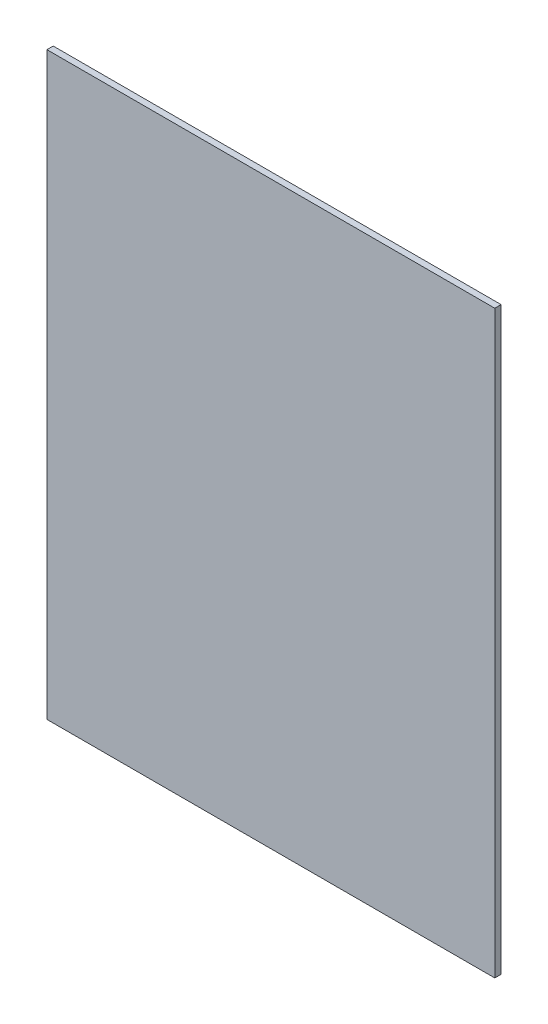
ISO-10303-21;
HEADER;
FILE_DESCRIPTION(('STEP AP214'),'2;1');
FILE_NAME('part.step','',(''),(''),'','','');
FILE_SCHEMA(('AUTOMOTIVE_DESIGN { 1 0 10303 214 1 1 1 1 }'));
ENDSEC;
DATA;
#1=APPLICATION_CONTEXT('core data for automotive mechanical design processes');
#2=APPLICATION_PROTOCOL_DEFINITION('international standard','automotive_design',2000,#1);
#3=PRODUCT_CONTEXT('',#1,'mechanical');
#4=PRODUCT('Part','Part','',(#3));
#5=PRODUCT_RELATED_PRODUCT_CATEGORY('part','',(#4));
#6=PRODUCT_DEFINITION_FORMATION('','',#4);
#7=PRODUCT_DEFINITION_CONTEXT('part definition',#1,'design');
#8=PRODUCT_DEFINITION('design','',#6,#7);
#9=PRODUCT_DEFINITION_SHAPE('','',#8);
#10=(LENGTH_UNIT() NAMED_UNIT(*) SI_UNIT(.MILLI.,.METRE.));
#11=(NAMED_UNIT(*) PLANE_ANGLE_UNIT() SI_UNIT($,.RADIAN.));
#12=(NAMED_UNIT(*) SI_UNIT($,.STERADIAN.) SOLID_ANGLE_UNIT());
#13=UNCERTAINTY_MEASURE_WITH_UNIT(LENGTH_MEASURE(1.E-05),#10,'distance_accuracy_value','');
#14=(GEOMETRIC_REPRESENTATION_CONTEXT(3) GLOBAL_UNCERTAINTY_ASSIGNED_CONTEXT((#13)) GLOBAL_UNIT_ASSIGNED_CONTEXT((#10,
#11,#12)) REPRESENTATION_CONTEXT('',''));
#15=CARTESIAN_POINT('',(0.,0.,0.));
#16=DIRECTION('',(0.,0.,1.));
#17=DIRECTION('',(1.,0.,0.));
#18=AXIS2_PLACEMENT_3D('',#15,#16,#17);
#19=CARTESIAN_POINT('',(0.,0.,3.175));
#20=DIRECTION('',(1.,0.,0.));
#21=DIRECTION('',(0.,0.,-1.));
#22=AXIS2_PLACEMENT_3D('',#19,#20,#21);
#23=PLANE('',#22);
#24=DIRECTION('',(0.,-1.,0.));
#25=VECTOR('',#24,1.);
#26=CARTESIAN_POINT('',(0.,0.,0.));
#27=LINE('',#26,#25);
#28=CARTESIAN_POINT('',(0.,292.1,0.));
#29=VERTEX_POINT('',#28);
#30=CARTESIAN_POINT('',(0.,0.,0.));
#31=VERTEX_POINT('',#30);
#32=EDGE_CURVE('E96',#29,#31,#27,.T.);
#33=ORIENTED_EDGE('',*,*,#32,.T.);
#34=DIRECTION('',(0.,0.,-1.));
#35=VECTOR('',#34,1.);
#36=CARTESIAN_POINT('',(0.,0.,3.175));
#37=LINE('',#36,#35);
#38=CARTESIAN_POINT('',(0.,0.,3.175));
#39=VERTEX_POINT('',#38);
#40=EDGE_CURVE('E11',#39,#31,#37,.T.);
#41=ORIENTED_EDGE('',*,*,#40,.F.);
#42=DIRECTION('',(0.,-1.,0.));
#43=VECTOR('',#42,1.);
#44=CARTESIAN_POINT('',(0.,0.,3.175));
#45=LINE('',#44,#43);
#46=CARTESIAN_POINT('',(0.,292.1,3.175));
#47=VERTEX_POINT('',#46);
#48=EDGE_CURVE('E84',#47,#39,#45,.T.);
#49=ORIENTED_EDGE('',*,*,#48,.F.);
#50=DIRECTION('',(0.,0.,-1.));
#51=VECTOR('',#50,1.);
#52=CARTESIAN_POINT('',(0.,292.1,3.175));
#53=LINE('',#52,#51);
#54=EDGE_CURVE('E92',#47,#29,#53,.T.);
#55=ORIENTED_EDGE('',*,*,#54,.T.);
#56=EDGE_LOOP('',(#33,#41,#49,#55));
#57=FACE_BOUND('',#56,.T.);
#58=ADVANCED_FACE('F33',(#57),#23,.F.);
#59=CARTESIAN_POINT('',(0.,0.,3.175));
#60=DIRECTION('',(0.,1.,0.));
#61=DIRECTION('',(0.,0.,1.));
#62=AXIS2_PLACEMENT_3D('',#59,#60,#61);
#63=PLANE('',#62);
#64=DIRECTION('',(1.,0.,0.));
#65=VECTOR('',#64,1.);
#66=CARTESIAN_POINT('',(0.,0.,0.));
#67=LINE('',#66,#65);
#68=CARTESIAN_POINT('',(225.552,0.,0.));
#69=VERTEX_POINT('',#68);
#70=EDGE_CURVE('E88',#31,#69,#67,.T.);
#71=ORIENTED_EDGE('',*,*,#70,.T.);
#72=DIRECTION('',(0.,0.,-1.));
#73=VECTOR('',#72,1.);
#74=CARTESIAN_POINT('',(225.552,0.,3.175));
#75=LINE('',#74,#73);
#76=CARTESIAN_POINT('',(225.552,0.,3.175));
#77=VERTEX_POINT('',#76);
#78=EDGE_CURVE('E41',#77,#69,#75,.T.);
#79=ORIENTED_EDGE('',*,*,#78,.F.);
#80=DIRECTION('',(1.,0.,0.));
#81=VECTOR('',#80,1.);
#82=CARTESIAN_POINT('',(0.,0.,3.175));
#83=LINE('',#82,#81);
#84=EDGE_CURVE('E79',#39,#77,#83,.T.);
#85=ORIENTED_EDGE('',*,*,#84,.F.);
#86=ORIENTED_EDGE('',*,*,#40,.T.);
#87=EDGE_LOOP('',(#71,#79,#85,#86));
#88=FACE_BOUND('',#87,.T.);
#89=ADVANCED_FACE('F87',(#88),#63,.F.);
#90=CARTESIAN_POINT('',(225.552,0.,3.175));
#91=DIRECTION('',(-1.,0.,0.));
#92=DIRECTION('',(0.,0.,1.));
#93=AXIS2_PLACEMENT_3D('',#90,#91,#92);
#94=PLANE('',#93);
#95=DIRECTION('',(0.,1.,0.));
#96=VECTOR('',#95,1.);
#97=CARTESIAN_POINT('',(225.552,0.,0.));
#98=LINE('',#97,#96);
#99=CARTESIAN_POINT('',(225.552,292.1,0.));
#100=VERTEX_POINT('',#99);
#101=EDGE_CURVE('E66',#69,#100,#98,.T.);
#102=ORIENTED_EDGE('',*,*,#101,.T.);
#103=DIRECTION('',(0.,0.,-1.));
#104=VECTOR('',#103,1.);
#105=CARTESIAN_POINT('',(225.552,292.1,3.175));
#106=LINE('',#105,#104);
#107=CARTESIAN_POINT('',(225.552,292.1,3.175));
#108=VERTEX_POINT('',#107);
#109=EDGE_CURVE('E89',#108,#100,#106,.T.);
#110=ORIENTED_EDGE('',*,*,#109,.F.);
#111=DIRECTION('',(0.,1.,0.));
#112=VECTOR('',#111,1.);
#113=CARTESIAN_POINT('',(225.552,0.,3.175));
#114=LINE('',#113,#112);
#115=EDGE_CURVE('E82',#77,#108,#114,.T.);
#116=ORIENTED_EDGE('',*,*,#115,.F.);
#117=ORIENTED_EDGE('',*,*,#78,.T.);
#118=EDGE_LOOP('',(#102,#110,#116,#117));
#119=FACE_BOUND('',#118,.T.);
#120=ADVANCED_FACE('F90',(#119),#94,.F.);
#121=CARTESIAN_POINT('',(0.,292.1,3.175));
#122=DIRECTION('',(0.,-1.,0.));
#123=DIRECTION('',(0.,0.,-1.));
#124=AXIS2_PLACEMENT_3D('',#121,#122,#123);
#125=PLANE('',#124);
#126=DIRECTION('',(-1.,0.,0.));
#127=VECTOR('',#126,1.);
#128=CARTESIAN_POINT('',(0.,292.1,0.));
#129=LINE('',#128,#127);
#130=EDGE_CURVE('E72',#100,#29,#129,.T.);
#131=ORIENTED_EDGE('',*,*,#130,.T.);
#132=ORIENTED_EDGE('',*,*,#54,.F.);
#133=DIRECTION('',(-1.,0.,0.));
#134=VECTOR('',#133,1.);
#135=CARTESIAN_POINT('',(0.,292.1,3.175));
#136=LINE('',#135,#134);
#137=EDGE_CURVE('E49',#108,#47,#136,.T.);
#138=ORIENTED_EDGE('',*,*,#137,.F.);
#139=ORIENTED_EDGE('',*,*,#109,.T.);
#140=EDGE_LOOP('',(#131,#132,#138,#139));
#141=FACE_BOUND('',#140,.T.);
#142=ADVANCED_FACE('F103',(#141),#125,.F.);
#143=CARTESIAN_POINT('',(0.,0.,3.175));
#144=DIRECTION('',(0.,0.,-1.));
#145=DIRECTION('',(-1.,0.,0.));
#146=AXIS2_PLACEMENT_3D('',#143,#144,#145);
#147=PLANE('',#146);
#148=ORIENTED_EDGE('',*,*,#48,.T.);
#149=ORIENTED_EDGE('',*,*,#84,.T.);
#150=ORIENTED_EDGE('',*,*,#115,.T.);
#151=ORIENTED_EDGE('',*,*,#137,.T.);
#152=EDGE_LOOP('',(#148,#149,#150,#151));
#153=FACE_BOUND('',#152,.T.);
#154=ADVANCED_FACE('F80',(#153),#147,.F.);
#155=CARTESIAN_POINT('',(0.,0.,0.));
#156=DIRECTION('',(0.,0.,-1.));
#157=DIRECTION('',(-1.,0.,0.));
#158=AXIS2_PLACEMENT_3D('',#155,#156,#157);
#159=PLANE('',#158);
#160=ORIENTED_EDGE('',*,*,#32,.F.);
#161=ORIENTED_EDGE('',*,*,#130,.F.);
#162=ORIENTED_EDGE('',*,*,#101,.F.);
#163=ORIENTED_EDGE('',*,*,#70,.F.);
#164=EDGE_LOOP('',(#160,#161,#162,#163));
#165=FACE_BOUND('',#164,.T.);
#166=ADVANCED_FACE('F106',(#165),#159,.T.);
#167=CLOSED_SHELL('',(#58,#89,#120,#142,#154,#166));
#168=MANIFOLD_SOLID_BREP('B2',#167);
#169=ADVANCED_BREP_SHAPE_REPRESENTATION('',(#18,#168),#14);
#170=SHAPE_DEFINITION_REPRESENTATION(#9,#169);
ENDSEC;
END-ISO-10303-21;
